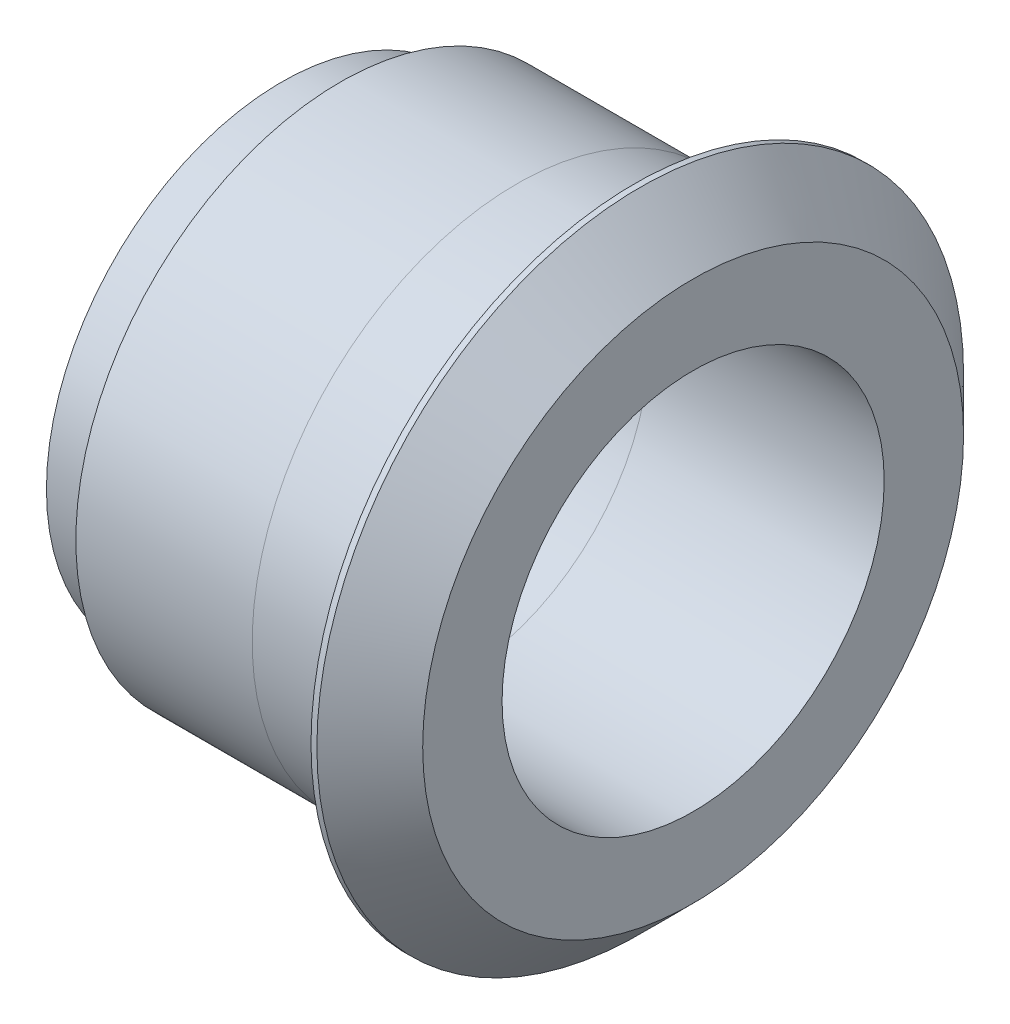
ISO-10303-21;
HEADER;
FILE_DESCRIPTION(('STEP AP214'),'2;1');
FILE_NAME('part.step','',(''),(''),'','','');
FILE_SCHEMA(('AUTOMOTIVE_DESIGN { 1 0 10303 214 1 1 1 1 }'));
ENDSEC;
DATA;
#1=APPLICATION_CONTEXT('core data for automotive mechanical design processes');
#2=APPLICATION_PROTOCOL_DEFINITION('international standard','automotive_design',2000,#1);
#3=PRODUCT_CONTEXT('',#1,'mechanical');
#4=PRODUCT('Part','Part','',(#3));
#5=PRODUCT_RELATED_PRODUCT_CATEGORY('part','',(#4));
#6=PRODUCT_DEFINITION_FORMATION('','',#4);
#7=PRODUCT_DEFINITION_CONTEXT('part definition',#1,'design');
#8=PRODUCT_DEFINITION('design','',#6,#7);
#9=PRODUCT_DEFINITION_SHAPE('','',#8);
#10=(LENGTH_UNIT() NAMED_UNIT(*) SI_UNIT(.MILLI.,.METRE.));
#11=(NAMED_UNIT(*) PLANE_ANGLE_UNIT() SI_UNIT($,.RADIAN.));
#12=(NAMED_UNIT(*) SI_UNIT($,.STERADIAN.) SOLID_ANGLE_UNIT());
#13=UNCERTAINTY_MEASURE_WITH_UNIT(LENGTH_MEASURE(1.E-05),#10,'distance_accuracy_value','');
#14=(GEOMETRIC_REPRESENTATION_CONTEXT(3) GLOBAL_UNCERTAINTY_ASSIGNED_CONTEXT((#13)) GLOBAL_UNIT_ASSIGNED_CONTEXT((#10,
#11,#12)) REPRESENTATION_CONTEXT('',''));
#15=CARTESIAN_POINT('',(0.,0.,0.));
#16=DIRECTION('',(0.,0.,1.));
#17=DIRECTION('',(1.,0.,0.));
#18=AXIS2_PLACEMENT_3D('',#15,#16,#17);
#19=CARTESIAN_POINT('',(-5.91819999999999,0.,-228.336665427124));
#20=DIRECTION('',(-1.,0.,0.));
#21=DIRECTION('',(0.,0.,1.));
#22=AXIS2_PLACEMENT_3D('',#19,#20,#21);
#23=PLANE('',#22);
#24=CARTESIAN_POINT('',(-5.91819999999999,0.,-216.033540427124));
#25=DIRECTION('',(1.,0.,0.));
#26=DIRECTION('',(0.,0.,-1.));
#27=AXIS2_PLACEMENT_3D('',#24,#25,#26);
#28=CIRCLE('',#27,12.303125);
#29=CARTESIAN_POINT('',(-5.91819999999999,0.,-228.336665427124));
#30=VERTEX_POINT('',#29);
#31=EDGE_CURVE('E11',#30,#30,#28,.T.);
#32=ORIENTED_EDGE('',*,*,#31,.F.);
#33=EDGE_LOOP('',(#32));
#34=FACE_BOUND('',#33,.T.);
#35=CARTESIAN_POINT('',(-5.91819999999998,0.,-216.033540427124));
#36=DIRECTION('',(-1.,0.,0.));
#37=DIRECTION('',(0.,0.,1.));
#38=AXIS2_PLACEMENT_3D('',#35,#36,#37);
#39=CIRCLE('',#38,10.31875);
#40=CARTESIAN_POINT('',(-5.91819999999998,0.,-205.714790427124));
#41=VERTEX_POINT('',#40);
#42=EDGE_CURVE('E70',#41,#41,#39,.T.);
#43=ORIENTED_EDGE('',*,*,#42,.F.);
#44=EDGE_LOOP('',(#43));
#45=FACE_BOUND('',#44,.T.);
#46=ADVANCED_FACE('F53',(#34,#45),#23,.T.);
#47=CARTESIAN_POINT('',(-2.74319999999998,0.,-230.321040427124));
#48=DIRECTION('',(-1.,0.,0.));
#49=DIRECTION('',(0.,0.,1.));
#50=AXIS2_PLACEMENT_3D('',#47,#48,#49);
#51=PLANE('',#50);
#52=CARTESIAN_POINT('',(-2.74319999999999,0.,-216.033540427124));
#53=DIRECTION('',(-1.,0.,0.));
#54=DIRECTION('',(0.,0.,1.));
#55=AXIS2_PLACEMENT_3D('',#52,#53,#54);
#56=CIRCLE('',#55,14.2875);
#57=CARTESIAN_POINT('',(-2.74319999999998,0.,-230.321040427124));
#58=VERTEX_POINT('',#57);
#59=EDGE_CURVE('E57',#58,#58,#56,.T.);
#60=ORIENTED_EDGE('',*,*,#59,.T.);
#61=EDGE_LOOP('',(#60));
#62=FACE_BOUND('',#61,.T.);
#63=CARTESIAN_POINT('',(-2.74319999999998,0.,-216.033540427124));
#64=DIRECTION('',(1.,0.,0.));
#65=DIRECTION('',(0.,0.,-1.));
#66=AXIS2_PLACEMENT_3D('',#63,#64,#65);
#67=CIRCLE('',#66,12.303125);
#68=CARTESIAN_POINT('',(-2.74319999999998,0.,-228.336665427124));
#69=VERTEX_POINT('',#68);
#70=EDGE_CURVE('E61',#69,#69,#67,.T.);
#71=ORIENTED_EDGE('',*,*,#70,.T.);
#72=EDGE_LOOP('',(#71));
#73=FACE_BOUND('',#72,.T.);
#74=ADVANCED_FACE('F84',(#62,#73),#51,.T.);
#75=CARTESIAN_POINT('',(-5.8839094316067,0.,-216.033540427124));
#76=DIRECTION('',(1.,0.,0.));
#77=DIRECTION('',(0.,0.,-1.));
#78=AXIS2_PLACEMENT_3D('',#75,#76,#77);
#79=CYLINDRICAL_SURFACE('',#78,12.303125);
#80=ORIENTED_EDGE('',*,*,#70,.F.);
#81=EDGE_LOOP('',(#80));
#82=FACE_BOUND('',#81,.T.);
#83=ORIENTED_EDGE('',*,*,#31,.T.);
#84=EDGE_LOOP('',(#83));
#85=FACE_BOUND('',#84,.T.);
#86=ADVANCED_FACE('F98',(#82,#85),#79,.T.);
#87=CARTESIAN_POINT('',(6.78180000000002,0.,-216.033540427124));
#88=DIRECTION('',(-1.,0.,0.));
#89=DIRECTION('',(0.,0.,1.));
#90=AXIS2_PLACEMENT_3D('',#87,#88,#89);
#91=CYLINDRICAL_SURFACE('',#90,10.31875);
#92=CARTESIAN_POINT('',(6.78180000000002,0.,-216.033540427124));
#93=DIRECTION('',(1.,0.,0.));
#94=DIRECTION('',(0.,0.,-1.));
#95=AXIS2_PLACEMENT_3D('',#92,#93,#94);
#96=CIRCLE('',#95,10.31875);
#97=CARTESIAN_POINT('',(6.78180000000002,0.,-226.352290427124));
#98=VERTEX_POINT('',#97);
#99=EDGE_CURVE('E66',#98,#98,#96,.T.);
#100=ORIENTED_EDGE('',*,*,#99,.T.);
#101=EDGE_LOOP('',(#100));
#102=FACE_BOUND('',#101,.T.);
#103=ORIENTED_EDGE('',*,*,#42,.T.);
#104=EDGE_LOOP('',(#103));
#105=FACE_BOUND('',#104,.T.);
#106=ADVANCED_FACE('F55',(#102,#105),#91,.F.);
#107=CARTESIAN_POINT('',(-52.6793525448111,0.,-216.033540427124));
#108=DIRECTION('',(1.,0.,0.));
#109=DIRECTION('',(0.,0.,-1.));
#110=AXIS2_PLACEMENT_3D('',#107,#108,#109);
#111=CYLINDRICAL_SURFACE('',#110,14.2875);
#112=CARTESIAN_POINT('',(3.60680000000002,0.,-216.033540427124));
#113=DIRECTION('',(1.,0.,0.));
#114=DIRECTION('',(0.,0.,-1.));
#115=AXIS2_PLACEMENT_3D('',#112,#113,#114);
#116=CIRCLE('',#115,14.2875);
#117=CARTESIAN_POINT('',(3.60680000000001,0.,-230.321040427124));
#118=VERTEX_POINT('',#117);
#119=EDGE_CURVE('E129',#118,#118,#116,.F.);
#120=CARTESIAN_POINT('',(3.60680000000001,0.,-230.321040427124));
#121=CARTESIAN_POINT('',(3.54065416666668,0.,-230.321040427124));
#122=CARTESIAN_POINT('',(3.47450833333335,0.,-230.321040427124));
#123=CARTESIAN_POINT('',(3.34221666666668,0.,-230.321040427124));
#124=CARTESIAN_POINT('',(3.27607083333335,0.,-230.321040427124));
#125=CARTESIAN_POINT('',(3.14377916666668,0.,-230.321040427124));
#126=CARTESIAN_POINT('',(3.07763333333335,0.,-230.321040427124));
#127=CARTESIAN_POINT('',(2.94534166666668,0.,-230.321040427124));
#128=CARTESIAN_POINT('',(2.87919583333335,0.,-230.321040427124));
#129=CARTESIAN_POINT('',(2.74690416666668,0.,-230.321040427124));
#130=CARTESIAN_POINT('',(2.68075833333335,0.,-230.321040427124));
#131=CARTESIAN_POINT('',(2.54846666666668,0.,-230.321040427124));
#132=CARTESIAN_POINT('',(2.48232083333335,0.,-230.321040427124));
#133=CARTESIAN_POINT('',(2.35002916666668,0.,-230.321040427124));
#134=CARTESIAN_POINT('',(2.28388333333335,0.,-230.321040427124));
#135=CARTESIAN_POINT('',(2.15159166666668,0.,-230.321040427124));
#136=CARTESIAN_POINT('',(2.08544583333335,0.,-230.321040427124));
#137=CARTESIAN_POINT('',(1.95315416666668,0.,-230.321040427124));
#138=CARTESIAN_POINT('',(1.88700833333335,0.,-230.321040427124));
#139=CARTESIAN_POINT('',(1.75471666666668,0.,-230.321040427124));
#140=CARTESIAN_POINT('',(1.68857083333335,0.,-230.321040427124));
#141=CARTESIAN_POINT('',(1.55627916666668,0.,-230.321040427124));
#142=CARTESIAN_POINT('',(1.49013333333335,0.,-230.321040427124));
#143=CARTESIAN_POINT('',(1.35784166666668,0.,-230.321040427124));
#144=CARTESIAN_POINT('',(1.29169583333335,0.,-230.321040427124));
#145=CARTESIAN_POINT('',(1.15940416666668,0.,-230.321040427124));
#146=CARTESIAN_POINT('',(1.09325833333335,0.,-230.321040427124));
#147=CARTESIAN_POINT('',(0.960966666666683,0.,-230.321040427124));
#148=CARTESIAN_POINT('',(0.894820833333349,0.,-230.321040427124));
#149=CARTESIAN_POINT('',(0.762529166666683,0.,-230.321040427124));
#150=CARTESIAN_POINT('',(0.696383333333351,0.,-230.321040427124));
#151=CARTESIAN_POINT('',(0.564091666666685,0.,-230.321040427124));
#152=CARTESIAN_POINT('',(0.497945833333351,0.,-230.321040427124));
#153=CARTESIAN_POINT('',(0.365654166666683,0.,-230.321040427124));
#154=CARTESIAN_POINT('',(0.299508333333349,0.,-230.321040427124));
#155=CARTESIAN_POINT('',(0.167216666666683,0.,-230.321040427124));
#156=CARTESIAN_POINT('',(0.101070833333351,0.,-230.321040427124));
#157=CARTESIAN_POINT('',(-0.0312208333333152,0.,-230.321040427124));
#158=CARTESIAN_POINT('',(-0.0973666666666493,0.,-230.321040427124));
#159=CARTESIAN_POINT('',(-0.229658333333315,0.,-230.321040427124));
#160=CARTESIAN_POINT('',(-0.295804166666647,0.,-230.321040427124));
#161=CARTESIAN_POINT('',(-0.428095833333313,0.,-230.321040427124));
#162=CARTESIAN_POINT('',(-0.494241666666647,0.,-230.321040427124));
#163=CARTESIAN_POINT('',(-0.626533333333316,0.,-230.321040427124));
#164=CARTESIAN_POINT('',(-0.69267916666665,0.,-230.321040427124));
#165=CARTESIAN_POINT('',(-0.824970833333316,0.,-230.321040427124));
#166=CARTESIAN_POINT('',(-0.891116666666647,0.,-230.321040427124));
#167=CARTESIAN_POINT('',(-1.02340833333331,0.,-230.321040427124));
#168=CARTESIAN_POINT('',(-1.08955416666665,0.,-230.321040427124));
#169=CARTESIAN_POINT('',(-1.22184583333332,0.,-230.321040427124));
#170=CARTESIAN_POINT('',(-1.28799166666665,0.,-230.321040427124));
#171=CARTESIAN_POINT('',(-1.42028333333332,0.,-230.321040427124));
#172=CARTESIAN_POINT('',(-1.48642916666665,0.,-230.321040427124));
#173=CARTESIAN_POINT('',(-1.61872083333331,0.,-230.321040427124));
#174=CARTESIAN_POINT('',(-1.68486666666665,0.,-230.321040427124));
#175=CARTESIAN_POINT('',(-1.81715833333332,0.,-230.321040427124));
#176=CARTESIAN_POINT('',(-1.88330416666665,0.,-230.321040427124));
#177=CARTESIAN_POINT('',(-2.01559583333332,0.,-230.321040427124));
#178=CARTESIAN_POINT('',(-2.08174166666665,0.,-230.321040427124));
#179=CARTESIAN_POINT('',(-2.21403333333331,0.,-230.321040427124));
#180=CARTESIAN_POINT('',(-2.28017916666665,0.,-230.321040427124));
#181=CARTESIAN_POINT('',(-2.41247083333331,0.,-230.321040427124));
#182=CARTESIAN_POINT('',(-2.47861666666665,0.,-230.321040427124));
#183=CARTESIAN_POINT('',(-2.61090833333331,0.,-230.321040427124));
#184=CARTESIAN_POINT('',(-2.67705416666665,0.,-230.321040427124));
#185=CARTESIAN_POINT('',(-2.74319999999998,0.,-230.321040427124));
#186=B_SPLINE_CURVE_WITH_KNOTS('',3,(#120,#121,#122,#123,#124,#125,#126,#127,#128,#129,#130,
#131,#132,#133,#134,#135,#136,#137,#138,#139,#140,#141,#142,#143,#144,#145,#146,#147,#148,#149,
#150,#151,#152,#153,#154,#155,#156,#157,#158,#159,#160,#161,#162,#163,#164,#165,#166,#167,#168,
#169,#170,#171,#172,#173,#174,#175,#176,#177,#178,#179,#180,#181,#182,#183,#184,#185),
.UNSPECIFIED.,.F.,.F.,(4,2,2,2,2,2,2,2,2,2,2,2,2,2,2,2,2,2,2,2,2,2,2,2,2,2,2,2,2,2,2,2,4),(0.,
0.198437500000002,0.396874999999998,0.5953125,0.793749999999996,0.992187499999998,1.190625,
1.3890625,1.5875,1.7859375,1.984375,2.1828125,2.38125,2.5796875,2.778125,2.97656249999999,3.175,
3.3734375,3.571875,3.7703125,3.96874999999999,4.1671875,4.365625,4.56406249999999,4.7625,
4.9609375,5.15937499999999,5.3578125,5.55625,5.75468749999999,5.953125,6.15156249999999,
6.34999999999999),.UNSPECIFIED.);
#187=EDGE_CURVE('BSEAM87',#118,#58,#186,.T.);
#188=ORIENTED_EDGE('',*,*,#119,.T.);
#189=ORIENTED_EDGE('',*,*,#59,.F.);
#190=ORIENTED_EDGE('',*,*,#187,.T.);
#191=ORIENTED_EDGE('',*,*,#187,.F.);
#192=EDGE_LOOP('',(#188,#190,#189,#191));
#193=FACE_BOUND('',#192,.T.);
#194=ADVANCED_FACE('F87',(#193),#111,.T.);
#195=CARTESIAN_POINT('',(3.60680000000002,0.,-216.033540427124));
#196=DIRECTION('',(1.,0.,0.));
#197=DIRECTION('',(0.,0.,-1.));
#198=AXIS2_PLACEMENT_3D('',#195,#196,#197);
#199=PLANE('',#198);
#200=CARTESIAN_POINT('',(3.60680000000002,0.,-216.033540427124));
#201=DIRECTION('',(1.,0.,0.));
#202=DIRECTION('',(0.,0.,-1.));
#203=AXIS2_PLACEMENT_3D('',#200,#201,#202);
#204=CIRCLE('',#203,17.4625);
#205=CARTESIAN_POINT('',(3.60680000000002,0.,-233.496040427124));
#206=VERTEX_POINT('',#205);
#207=EDGE_CURVE('E131',#206,#206,#204,.T.);
#208=ORIENTED_EDGE('',*,*,#207,.F.);
#209=EDGE_LOOP('',(#208));
#210=FACE_BOUND('',#209,.T.);
#211=ORIENTED_EDGE('',*,*,#119,.F.);
#212=EDGE_LOOP('',(#211));
#213=FACE_BOUND('',#212,.T.);
#214=ADVANCED_FACE('F89',(#210,#213),#199,.F.);
#215=CARTESIAN_POINT('',(6.78180000000002,0.,-216.033540427124));
#216=DIRECTION('',(1.,0.,0.));
#217=DIRECTION('',(0.,0.,-1.));
#218=AXIS2_PLACEMENT_3D('',#215,#216,#217);
#219=PLANE('',#218);
#220=CARTESIAN_POINT('',(6.78180000000002,0.,-216.033540427124));
#221=DIRECTION('',(1.,0.,0.));
#222=DIRECTION('',(0.,0.,-1.));
#223=AXIS2_PLACEMENT_3D('',#220,#221,#222);
#224=CIRCLE('',#223,14.605);
#225=CARTESIAN_POINT('',(6.78180000000002,0.,-230.638540427124));
#226=VERTEX_POINT('',#225);
#227=EDGE_CURVE('E76',#226,#226,#224,.T.);
#228=ORIENTED_EDGE('',*,*,#227,.T.);
#229=EDGE_LOOP('',(#228));
#230=FACE_BOUND('',#229,.T.);
#231=ORIENTED_EDGE('',*,*,#99,.F.);
#232=EDGE_LOOP('',(#231));
#233=FACE_BOUND('',#232,.T.);
#234=ADVANCED_FACE('F95',(#230,#233),#219,.T.);
#235=CARTESIAN_POINT('',(6.78180000000002,0.,-216.033540427124));
#236=DIRECTION('',(-1.,0.,0.));
#237=DIRECTION('',(0.,0.,1.));
#238=AXIS2_PLACEMENT_3D('',#235,#236,#237);
#239=CYLINDRICAL_SURFACE('',#238,17.4625);
#240=CARTESIAN_POINT('',(3.92429999999999,0.,-216.033540427124));
#241=DIRECTION('',(1.,0.,0.));
#242=DIRECTION('',(0.,0.,-1.));
#243=AXIS2_PLACEMENT_3D('',#240,#241,#242);
#244=CIRCLE('',#243,17.4625);
#245=CARTESIAN_POINT('',(3.92429999999999,0.,-233.496040427124));
#246=VERTEX_POINT('',#245);
#247=EDGE_CURVE('E72',#246,#246,#244,.F.);
#248=ORIENTED_EDGE('',*,*,#247,.T.);
#249=EDGE_LOOP('',(#248));
#250=FACE_BOUND('',#249,.T.);
#251=ORIENTED_EDGE('',*,*,#207,.T.);
#252=EDGE_LOOP('',(#251));
#253=FACE_BOUND('',#252,.T.);
#254=ADVANCED_FACE('F112',(#250,#253),#239,.T.);
#255=CARTESIAN_POINT('',(6.78180000000002,0.,-216.033540427124));
#256=DIRECTION('',(-1.,0.,0.));
#257=DIRECTION('',(0.,0.,1.));
#258=AXIS2_PLACEMENT_3D('',#255,#256,#257);
#259=CONICAL_SURFACE('',#258,14.605,0.785398163397448);
#260=ORIENTED_EDGE('',*,*,#247,.F.);
#261=EDGE_LOOP('',(#260));
#262=FACE_BOUND('',#261,.T.);
#263=ORIENTED_EDGE('',*,*,#227,.F.);
#264=EDGE_LOOP('',(#263));
#265=FACE_BOUND('',#264,.T.);
#266=ADVANCED_FACE('F105',(#262,#265),#259,.T.);
#267=CLOSED_SHELL('',(#46,#74,#86,#106,#194,#214,#234,#254,#266));
#268=MANIFOLD_SOLID_BREP('B2',#267);
#269=CARTESIAN_POINT('',(-5.91819999999999,0.,-228.336665427124));
#270=DIRECTION('',(-1.,0.,0.));
#271=DIRECTION('',(0.,0.,1.));
#272=AXIS2_PLACEMENT_3D('',#269,#270,#271);
#273=PLANE('',#272);
#274=CARTESIAN_POINT('',(-5.91819999999998,0.,-216.033540427124));
#275=DIRECTION('',(-1.,0.,0.));
#276=DIRECTION('',(0.,0.,1.));
#277=AXIS2_PLACEMENT_3D('',#274,#275,#276);
#278=CIRCLE('',#277,10.31875);
#279=CARTESIAN_POINT('',(-5.91819999999998,0.,-205.714790427124));
#280=VERTEX_POINT('',#279);
#281=EDGE_CURVE('E225',#280,#280,#278,.T.);
#282=ORIENTED_EDGE('',*,*,#281,.T.);
#283=EDGE_LOOP('',(#282));
#284=FACE_BOUND('',#283,.T.);
#285=CARTESIAN_POINT('',(-5.91819999999999,0.,-216.033540427124));
#286=DIRECTION('',(1.,0.,0.));
#287=DIRECTION('',(0.,0.,-1.));
#288=AXIS2_PLACEMENT_3D('',#285,#286,#287);
#289=CIRCLE('',#288,12.303125);
#290=CARTESIAN_POINT('',(-5.91819999999999,0.,-228.336665427124));
#291=VERTEX_POINT('',#290);
#292=EDGE_CURVE('E52',#291,#291,#289,.T.);
#293=ORIENTED_EDGE('',*,*,#292,.T.);
#294=EDGE_LOOP('',(#293));
#295=FACE_BOUND('',#294,.T.);
#296=ADVANCED_FACE('F214',(#284,#295),#273,.F.);
#297=CARTESIAN_POINT('',(-5.8839094316067,0.,-216.033540427124));
#298=DIRECTION('',(1.,0.,0.));
#299=DIRECTION('',(0.,0.,-1.));
#300=AXIS2_PLACEMENT_3D('',#297,#298,#299);
#301=CYLINDRICAL_SURFACE('',#300,12.303125);
#302=ORIENTED_EDGE('',*,*,#292,.F.);
#303=EDGE_LOOP('',(#302));
#304=FACE_BOUND('',#303,.T.);
#305=CARTESIAN_POINT('',(-2.74319999999998,0.,-216.033540427124));
#306=DIRECTION('',(1.,0.,0.));
#307=DIRECTION('',(0.,0.,-1.));
#308=AXIS2_PLACEMENT_3D('',#305,#306,#307);
#309=CIRCLE('',#308,12.303125);
#310=CARTESIAN_POINT('',(-2.74319999999998,0.,-228.336665427124));
#311=VERTEX_POINT('',#310);
#312=EDGE_CURVE('E218',#311,#311,#309,.T.);
#313=ORIENTED_EDGE('',*,*,#312,.T.);
#314=EDGE_LOOP('',(#313));
#315=FACE_BOUND('',#314,.T.);
#316=ADVANCED_FACE('F260',(#304,#315),#301,.F.);
#317=CARTESIAN_POINT('',(-2.74319999999998,0.,-230.321040427124));
#318=DIRECTION('',(-1.,0.,0.));
#319=DIRECTION('',(0.,0.,1.));
#320=AXIS2_PLACEMENT_3D('',#317,#318,#319);
#321=PLANE('',#320);
#322=ORIENTED_EDGE('',*,*,#312,.F.);
#323=EDGE_LOOP('',(#322));
#324=FACE_BOUND('',#323,.T.);
#325=CARTESIAN_POINT('',(-2.74319999999999,0.,-216.033540427124));
#326=DIRECTION('',(-1.,0.,0.));
#327=DIRECTION('',(0.,0.,1.));
#328=AXIS2_PLACEMENT_3D('',#325,#326,#327);
#329=CIRCLE('',#328,14.2875);
#330=CARTESIAN_POINT('',(-2.74319999999998,0.,-230.321040427124));
#331=VERTEX_POINT('',#330);
#332=EDGE_CURVE('E229',#331,#331,#329,.T.);
#333=ORIENTED_EDGE('',*,*,#332,.F.);
#334=EDGE_LOOP('',(#333));
#335=FACE_BOUND('',#334,.T.);
#336=ADVANCED_FACE('F216',(#324,#335),#321,.F.);
#337=CARTESIAN_POINT('',(-51.3642244842766,0.,-216.033540427124));
#338=DIRECTION('',(1.,0.,0.));
#339=DIRECTION('',(0.,0.,-1.));
#340=AXIS2_PLACEMENT_3D('',#337,#338,#339);
#341=CYLINDRICAL_SURFACE('',#340,12.7);
#342=CARTESIAN_POINT('',(-12.2682,0.,-216.033540427124));
#343=DIRECTION('',(-1.,0.,0.));
#344=DIRECTION('',(0.,0.,1.));
#345=AXIS2_PLACEMENT_3D('',#342,#343,#344);
#346=CIRCLE('',#345,12.7);
#347=CARTESIAN_POINT('',(-12.2682,0.,-203.333540427124));
#348=VERTEX_POINT('',#347);
#349=EDGE_CURVE('E233',#348,#348,#346,.T.);
#350=ORIENTED_EDGE('',*,*,#349,.T.);
#351=EDGE_LOOP('',(#350));
#352=FACE_BOUND('',#351,.T.);
#353=CARTESIAN_POINT('',(-15.4432,0.,-216.033540427124));
#354=DIRECTION('',(-1.,0.,0.));
#355=DIRECTION('',(0.,0.,1.));
#356=AXIS2_PLACEMENT_3D('',#353,#354,#355);
#357=CIRCLE('',#356,12.7);
#358=CARTESIAN_POINT('',(-15.4432,0.,-203.333540427124));
#359=VERTEX_POINT('',#358);
#360=EDGE_CURVE('E237',#359,#359,#357,.T.);
#361=ORIENTED_EDGE('',*,*,#360,.F.);
#362=EDGE_LOOP('',(#361));
#363=FACE_BOUND('',#362,.T.);
#364=ADVANCED_FACE('F248',(#352,#363),#341,.T.);
#365=CARTESIAN_POINT('',(-12.2682,0.,-216.033540427124));
#366=DIRECTION('',(1.,0.,0.));
#367=DIRECTION('',(0.,0.,-1.));
#368=AXIS2_PLACEMENT_3D('',#365,#366,#367);
#369=PLANE('',#368);
#370=ORIENTED_EDGE('',*,*,#349,.F.);
#371=EDGE_LOOP('',(#370));
#372=FACE_BOUND('',#371,.T.);
#373=CARTESIAN_POINT('',(-12.2682,0.,-216.033540427124));
#374=DIRECTION('',(1.,0.,0.));
#375=DIRECTION('',(0.,0.,-1.));
#376=AXIS2_PLACEMENT_3D('',#373,#374,#375);
#377=CIRCLE('',#376,14.2875);
#378=CARTESIAN_POINT('',(-12.2682,0.,-230.321040427124));
#379=VERTEX_POINT('',#378);
#380=EDGE_CURVE('E234',#379,#379,#377,.T.);
#381=ORIENTED_EDGE('',*,*,#380,.F.);
#382=EDGE_LOOP('',(#381));
#383=FACE_BOUND('',#382,.T.);
#384=ADVANCED_FACE('F250',(#372,#383),#369,.F.);
#385=CARTESIAN_POINT('',(-52.6793525448111,0.,-216.033540427124));
#386=DIRECTION('',(1.,0.,0.));
#387=DIRECTION('',(0.,0.,-1.));
#388=AXIS2_PLACEMENT_3D('',#385,#386,#387);
#389=CYLINDRICAL_SURFACE('',#388,14.2875);
#390=CARTESIAN_POINT('',(-2.74319999999998,0.,-230.321040427124));
#391=CARTESIAN_POINT('',(-2.84241874999998,0.,-230.321040427124));
#392=CARTESIAN_POINT('',(-2.94163749999998,0.,-230.321040427124));
#393=CARTESIAN_POINT('',(-3.14007499999998,0.,-230.321040427124));
#394=CARTESIAN_POINT('',(-3.23929374999998,0.,-230.321040427124));
#395=CARTESIAN_POINT('',(-3.43773124999998,0.,-230.321040427124));
#396=CARTESIAN_POINT('',(-3.53694999999998,0.,-230.321040427124));
#397=CARTESIAN_POINT('',(-3.73538749999998,0.,-230.321040427124));
#398=CARTESIAN_POINT('',(-3.83460624999998,0.,-230.321040427124));
#399=CARTESIAN_POINT('',(-4.03304374999998,0.,-230.321040427124));
#400=CARTESIAN_POINT('',(-4.13226249999998,0.,-230.321040427124));
#401=CARTESIAN_POINT('',(-4.33069999999998,0.,-230.321040427124));
#402=CARTESIAN_POINT('',(-4.42991874999998,0.,-230.321040427124));
#403=CARTESIAN_POINT('',(-4.62835624999998,0.,-230.321040427124));
#404=CARTESIAN_POINT('',(-4.72757499999998,0.,-230.321040427124));
#405=CARTESIAN_POINT('',(-4.92601249999998,0.,-230.321040427124));
#406=CARTESIAN_POINT('',(-5.02523124999998,0.,-230.321040427124));
#407=CARTESIAN_POINT('',(-5.22366874999998,0.,-230.321040427124));
#408=CARTESIAN_POINT('',(-5.32288749999998,0.,-230.321040427124));
#409=CARTESIAN_POINT('',(-5.52132499999998,0.,-230.321040427124));
#410=CARTESIAN_POINT('',(-5.62054374999998,0.,-230.321040427124));
#411=CARTESIAN_POINT('',(-5.81898124999998,0.,-230.321040427124));
#412=CARTESIAN_POINT('',(-5.91819999999998,0.,-230.321040427124));
#413=CARTESIAN_POINT('',(-6.11663749999998,0.,-230.321040427124));
#414=CARTESIAN_POINT('',(-6.21585624999998,0.,-230.321040427124));
#415=CARTESIAN_POINT('',(-6.41429374999998,0.,-230.321040427124));
#416=CARTESIAN_POINT('',(-6.51351249999998,0.,-230.321040427124));
#417=CARTESIAN_POINT('',(-6.71194999999998,0.,-230.321040427124));
#418=CARTESIAN_POINT('',(-6.81116874999998,0.,-230.321040427124));
#419=CARTESIAN_POINT('',(-7.00960624999998,0.,-230.321040427124));
#420=CARTESIAN_POINT('',(-7.10882499999998,0.,-230.321040427124));
#421=CARTESIAN_POINT('',(-7.30726249999998,0.,-230.321040427124));
#422=CARTESIAN_POINT('',(-7.40648124999998,0.,-230.321040427124));
#423=CARTESIAN_POINT('',(-7.60491874999998,0.,-230.321040427124));
#424=CARTESIAN_POINT('',(-7.70413749999998,0.,-230.321040427124));
#425=CARTESIAN_POINT('',(-7.90257499999998,0.,-230.321040427124));
#426=CARTESIAN_POINT('',(-8.00179374999998,0.,-230.321040427124));
#427=CARTESIAN_POINT('',(-8.20023124999998,0.,-230.321040427124));
#428=CARTESIAN_POINT('',(-8.29944999999998,0.,-230.321040427124));
#429=CARTESIAN_POINT('',(-8.49788749999998,0.,-230.321040427124));
#430=CARTESIAN_POINT('',(-8.59710624999999,0.,-230.321040427124));
#431=CARTESIAN_POINT('',(-8.79554374999998,0.,-230.321040427124));
#432=CARTESIAN_POINT('',(-8.89476249999998,0.,-230.321040427124));
#433=CARTESIAN_POINT('',(-9.09319999999998,0.,-230.321040427124));
#434=CARTESIAN_POINT('',(-9.19241874999999,0.,-230.321040427124));
#435=CARTESIAN_POINT('',(-9.39085624999998,0.,-230.321040427124));
#436=CARTESIAN_POINT('',(-9.49007499999998,0.,-230.321040427124));
#437=CARTESIAN_POINT('',(-9.68851249999998,0.,-230.321040427124));
#438=CARTESIAN_POINT('',(-9.78773124999999,0.,-230.321040427124));
#439=CARTESIAN_POINT('',(-9.98616874999998,0.,-230.321040427124));
#440=CARTESIAN_POINT('',(-10.0853875,0.,-230.321040427124));
#441=CARTESIAN_POINT('',(-10.283825,0.,-230.321040427124));
#442=CARTESIAN_POINT('',(-10.38304375,0.,-230.321040427124));
#443=CARTESIAN_POINT('',(-10.58148125,0.,-230.321040427124));
#444=CARTESIAN_POINT('',(-10.6807,0.,-230.321040427124));
#445=CARTESIAN_POINT('',(-10.8791375,0.,-230.321040427124));
#446=CARTESIAN_POINT('',(-10.97835625,0.,-230.321040427124));
#447=CARTESIAN_POINT('',(-11.17679375,0.,-230.321040427124));
#448=CARTESIAN_POINT('',(-11.2760125,0.,-230.321040427124));
#449=CARTESIAN_POINT('',(-11.47445,0.,-230.321040427124));
#450=CARTESIAN_POINT('',(-11.57366875,0.,-230.321040427124));
#451=CARTESIAN_POINT('',(-11.77210625,0.,-230.321040427124));
#452=CARTESIAN_POINT('',(-11.871325,0.,-230.321040427124));
#453=CARTESIAN_POINT('',(-12.0697625,0.,-230.321040427124));
#454=CARTESIAN_POINT('',(-12.16898125,0.,-230.321040427124));
#455=CARTESIAN_POINT('',(-12.2682,0.,-230.321040427124));
#456=B_SPLINE_CURVE_WITH_KNOTS('',3,(#390,#391,#392,#393,#394,#395,#396,#397,#398,#399,#400,
#401,#402,#403,#404,#405,#406,#407,#408,#409,#410,#411,#412,#413,#414,#415,#416,#417,#418,#419,
#420,#421,#422,#423,#424,#425,#426,#427,#428,#429,#430,#431,#432,#433,#434,#435,#436,#437,#438,
#439,#440,#441,#442,#443,#444,#445,#446,#447,#448,#449,#450,#451,#452,#453,#454,#455),
.UNSPECIFIED.,.F.,.F.,(4,2,2,2,2,2,2,2,2,2,2,2,2,2,2,2,2,2,2,2,2,2,2,2,2,2,2,2,2,2,2,2,4),(0.,
0.29765625,0.5953125,0.892968750000001,1.190625,1.48828125,1.7859375,2.08359375,2.38125,
2.67890625,2.9765625,3.27421875,3.571875,3.86953125,4.1671875,4.46484375,4.7625,5.06015625,
5.3578125,5.65546875,5.953125,6.25078125,6.5484375,6.84609375,7.14375,7.44140625,7.7390625,
8.03671875000001,8.334375,8.63203125,8.92968750000001,9.22734375000001,9.52500000000001),.UNSPECIFIED.);
#457=EDGE_CURVE('BSEAM257',#331,#379,#456,.T.);
#458=ORIENTED_EDGE('',*,*,#332,.T.);
#459=ORIENTED_EDGE('',*,*,#380,.T.);
#460=ORIENTED_EDGE('',*,*,#457,.T.);
#461=ORIENTED_EDGE('',*,*,#457,.F.);
#462=EDGE_LOOP('',(#458,#460,#459,#461));
#463=FACE_BOUND('',#462,.T.);
#464=ADVANCED_FACE('F257',(#463),#389,.T.);
#465=CARTESIAN_POINT('',(-15.4432,0.,-216.033540427124));
#466=DIRECTION('',(-1.,0.,0.));
#467=DIRECTION('',(0.,0.,1.));
#468=AXIS2_PLACEMENT_3D('',#465,#466,#467);
#469=PLANE('',#468);
#470=CARTESIAN_POINT('',(-15.4432,0.,-216.033540427124));
#471=DIRECTION('',(-1.,0.,0.));
#472=DIRECTION('',(0.,0.,1.));
#473=AXIS2_PLACEMENT_3D('',#470,#471,#472);
#474=CIRCLE('',#473,10.31875);
#475=CARTESIAN_POINT('',(-15.4432,0.,-205.714790427124));
#476=VERTEX_POINT('',#475);
#477=EDGE_CURVE('E238',#476,#476,#474,.T.);
#478=ORIENTED_EDGE('',*,*,#477,.F.);
#479=EDGE_LOOP('',(#478));
#480=FACE_BOUND('',#479,.T.);
#481=ORIENTED_EDGE('',*,*,#360,.T.);
#482=EDGE_LOOP('',(#481));
#483=FACE_BOUND('',#482,.T.);
#484=ADVANCED_FACE('F246',(#480,#483),#469,.T.);
#485=CARTESIAN_POINT('',(6.78180000000002,0.,-216.033540427124));
#486=DIRECTION('',(-1.,0.,0.));
#487=DIRECTION('',(0.,0.,1.));
#488=AXIS2_PLACEMENT_3D('',#485,#486,#487);
#489=CYLINDRICAL_SURFACE('',#488,10.31875);
#490=ORIENTED_EDGE('',*,*,#281,.F.);
#491=EDGE_LOOP('',(#490));
#492=FACE_BOUND('',#491,.T.);
#493=ORIENTED_EDGE('',*,*,#477,.T.);
#494=EDGE_LOOP('',(#493));
#495=FACE_BOUND('',#494,.T.);
#496=ADVANCED_FACE('F262',(#492,#495),#489,.F.);
#497=CLOSED_SHELL('',(#296,#316,#336,#364,#384,#464,#484,#496));
#498=MANIFOLD_SOLID_BREP('B6',#497);
#499=ADVANCED_BREP_SHAPE_REPRESENTATION('',(#18,#268,#498),#14);
#500=SHAPE_DEFINITION_REPRESENTATION(#9,#499);
ENDSEC;
END-ISO-10303-21;
